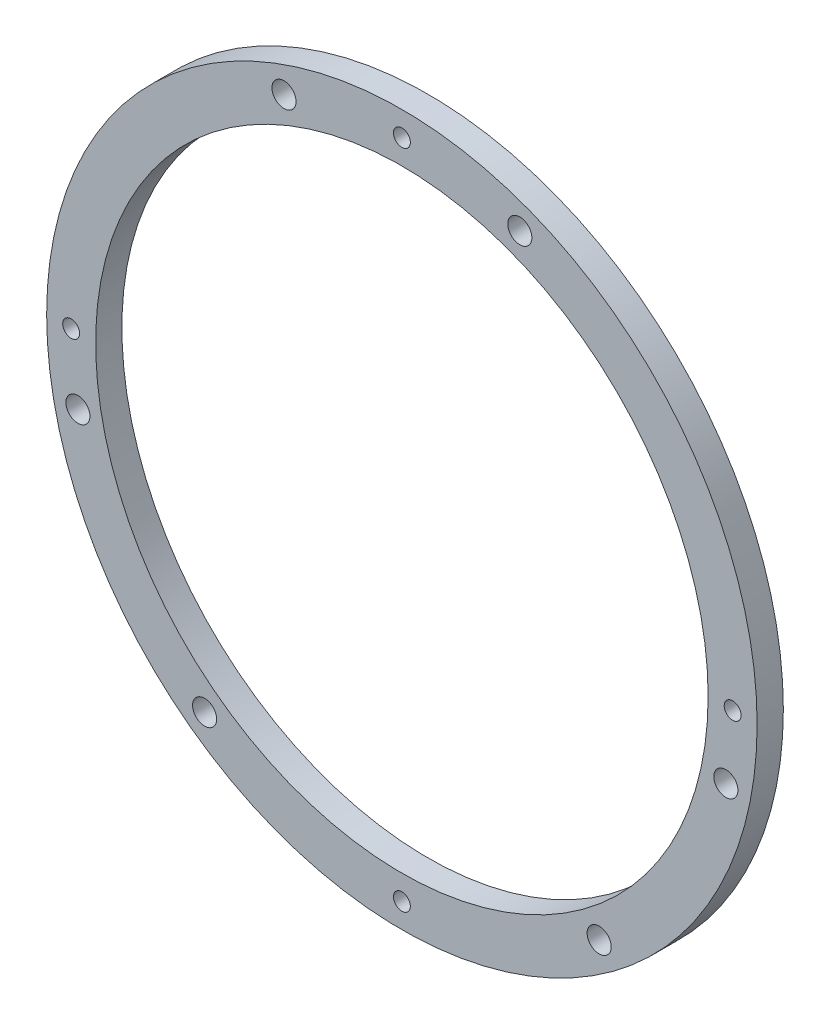
ISO-10303-21;
HEADER;
FILE_DESCRIPTION(('STEP AP214'),'2;1');
FILE_NAME('part.step','',(''),(''),'','','');
FILE_SCHEMA(('AUTOMOTIVE_DESIGN { 1 0 10303 214 1 1 1 1 }'));
ENDSEC;
DATA;
#1=APPLICATION_CONTEXT('core data for automotive mechanical design processes');
#2=APPLICATION_PROTOCOL_DEFINITION('international standard','automotive_design',2000,#1);
#3=PRODUCT_CONTEXT('',#1,'mechanical');
#4=PRODUCT('Part','Part','',(#3));
#5=PRODUCT_RELATED_PRODUCT_CATEGORY('part','',(#4));
#6=PRODUCT_DEFINITION_FORMATION('','',#4);
#7=PRODUCT_DEFINITION_CONTEXT('part definition',#1,'design');
#8=PRODUCT_DEFINITION('design','',#6,#7);
#9=PRODUCT_DEFINITION_SHAPE('','',#8);
#10=(LENGTH_UNIT() NAMED_UNIT(*) SI_UNIT(.MILLI.,.METRE.));
#11=(NAMED_UNIT(*) PLANE_ANGLE_UNIT() SI_UNIT($,.RADIAN.));
#12=(NAMED_UNIT(*) SI_UNIT($,.STERADIAN.) SOLID_ANGLE_UNIT());
#13=UNCERTAINTY_MEASURE_WITH_UNIT(LENGTH_MEASURE(1.E-05),#10,'distance_accuracy_value','');
#14=(GEOMETRIC_REPRESENTATION_CONTEXT(3) GLOBAL_UNCERTAINTY_ASSIGNED_CONTEXT((#13)) GLOBAL_UNIT_ASSIGNED_CONTEXT((#10,
#11,#12)) REPRESENTATION_CONTEXT('',''));
#15=CARTESIAN_POINT('',(0.,0.,0.));
#16=DIRECTION('',(0.,0.,1.));
#17=DIRECTION('',(1.,0.,0.));
#18=AXIS2_PLACEMENT_3D('',#15,#16,#17);
#19=CARTESIAN_POINT('',(0.,0.,-63.7794));
#20=DIRECTION('',(0.,0.,1.));
#21=DIRECTION('',(1.,0.,0.));
#22=AXIS2_PLACEMENT_3D('',#19,#20,#21);
#23=PLANE('',#22);
#24=CARTESIAN_POINT('',(40.9020969085849,-55.0475691423403,-63.7794));
#25=DIRECTION('',(0.,0.,1.));
#26=DIRECTION('',(1.,0.,0.));
#27=AXIS2_PLACEMENT_3D('',#24,#25,#26);
#28=CIRCLE('',#27,2.5);
#29=CARTESIAN_POINT('',(43.4020969085849,-55.0475691423403,-63.7794));
#30=VERTEX_POINT('',#29);
#31=EDGE_CURVE('E239',#30,#30,#28,.T.);
#32=ORIENTED_EDGE('',*,*,#31,.F.);
#33=EDGE_LOOP('',(#32));
#34=FACE_BOUND('',#33,.T.);
#35=CARTESIAN_POINT('',(-67.176013668197,-13.805780950392,-63.7794));
#36=DIRECTION('',(0.,0.,1.));
#37=DIRECTION('',(1.,0.,0.));
#38=AXIS2_PLACEMENT_3D('',#35,#36,#37);
#39=CIRCLE('',#38,2.50000000000001);
#40=CARTESIAN_POINT('',(-64.676013668197,-13.805780950392,-63.7794));
#41=VERTEX_POINT('',#40);
#42=EDGE_CURVE('E119',#41,#41,#39,.T.);
#43=ORIENTED_EDGE('',*,*,#42,.F.);
#44=EDGE_LOOP('',(#43));
#45=FACE_BOUND('',#44,.T.);
#46=CARTESIAN_POINT('',(-24.4499682778964,64.0735159891344,-63.7794));
#47=DIRECTION('',(0.,0.,1.));
#48=DIRECTION('',(1.,0.,0.));
#49=AXIS2_PLACEMENT_3D('',#46,#47,#48);
#50=CIRCLE('',#49,2.5);
#51=CARTESIAN_POINT('',(-21.9499682778964,64.0735159891344,-63.7794));
#52=VERTEX_POINT('',#51);
#53=EDGE_CURVE('E102',#52,#52,#50,.T.);
#54=ORIENTED_EDGE('',*,*,#53,.F.);
#55=EDGE_LOOP('',(#54));
#56=FACE_BOUND('',#55,.T.);
#57=CARTESIAN_POINT('',(68.58,0.,-63.7794));
#58=DIRECTION('',(0.,0.,1.));
#59=DIRECTION('',(1.,0.,0.));
#60=AXIS2_PLACEMENT_3D('',#57,#58,#59);
#61=CIRCLE('',#60,1.75);
#62=CARTESIAN_POINT('',(70.33,0.,-63.7794));
#63=VERTEX_POINT('',#62);
#64=EDGE_CURVE('E103',#63,#63,#61,.T.);
#65=ORIENTED_EDGE('',*,*,#64,.F.);
#66=EDGE_LOOP('',(#65));
#67=FACE_BOUND('',#66,.T.);
#68=CARTESIAN_POINT('',(-68.58,0.,-63.7794));
#69=DIRECTION('',(0.,0.,1.));
#70=DIRECTION('',(1.,0.,0.));
#71=AXIS2_PLACEMENT_3D('',#68,#69,#70);
#72=CIRCLE('',#71,1.75);
#73=CARTESIAN_POINT('',(-66.83,0.,-63.7794));
#74=VERTEX_POINT('',#73);
#75=EDGE_CURVE('E76',#74,#74,#72,.T.);
#76=ORIENTED_EDGE('',*,*,#75,.F.);
#77=EDGE_LOOP('',(#76));
#78=FACE_BOUND('',#77,.T.);
#79=CARTESIAN_POINT('',(0.,0.,-63.7794));
#80=DIRECTION('',(0.,0.,1.));
#81=DIRECTION('',(1.,0.,0.));
#82=AXIS2_PLACEMENT_3D('',#79,#80,#81);
#83=CIRCLE('',#82,73.66);
#84=CARTESIAN_POINT('',(73.66,0.,-63.7794));
#85=VERTEX_POINT('',#84);
#86=EDGE_CURVE('E11',#85,#85,#83,.T.);
#87=ORIENTED_EDGE('',*,*,#86,.T.);
#88=EDGE_LOOP('',(#87));
#89=FACE_BOUND('',#88,.T.);
#90=CARTESIAN_POINT('',(0.,0.,-63.7794));
#91=DIRECTION('',(0.,0.,1.));
#92=DIRECTION('',(1.,0.,0.));
#93=AXIS2_PLACEMENT_3D('',#90,#91,#92);
#94=CIRCLE('',#93,63.5);
#95=CARTESIAN_POINT('',(63.5,0.,-63.7794));
#96=VERTEX_POINT('',#95);
#97=EDGE_CURVE('E57',#96,#96,#94,.T.);
#98=ORIENTED_EDGE('',*,*,#97,.F.);
#99=EDGE_LOOP('',(#98));
#100=FACE_BOUND('',#99,.T.);
#101=CARTESIAN_POINT('',(0.,68.58,-63.7794));
#102=DIRECTION('',(0.,0.,1.));
#103=DIRECTION('',(1.,0.,0.));
#104=AXIS2_PLACEMENT_3D('',#101,#102,#103);
#105=CIRCLE('',#104,1.75);
#106=CARTESIAN_POINT('',(1.75,68.58,-63.7794));
#107=VERTEX_POINT('',#106);
#108=EDGE_CURVE('E77',#107,#107,#105,.T.);
#109=ORIENTED_EDGE('',*,*,#108,.F.);
#110=EDGE_LOOP('',(#109));
#111=FACE_BOUND('',#110,.T.);
#112=CARTESIAN_POINT('',(0.,-68.58,-63.7794));
#113=DIRECTION('',(0.,0.,1.));
#114=DIRECTION('',(1.,0.,0.));
#115=AXIS2_PLACEMENT_3D('',#112,#113,#114);
#116=CIRCLE('',#115,1.75);
#117=CARTESIAN_POINT('',(1.75000000000003,-68.58,-63.7794));
#118=VERTEX_POINT('',#117);
#119=EDGE_CURVE('E88',#118,#118,#116,.T.);
#120=ORIENTED_EDGE('',*,*,#119,.F.);
#121=EDGE_LOOP('',(#120));
#122=FACE_BOUND('',#121,.T.);
#123=CARTESIAN_POINT('',(24.4499682778964,64.0735159891344,-63.7794));
#124=DIRECTION('',(0.,0.,1.));
#125=DIRECTION('',(1.,0.,0.));
#126=AXIS2_PLACEMENT_3D('',#123,#124,#125);
#127=CIRCLE('',#126,2.5);
#128=CARTESIAN_POINT('',(26.9499682778964,64.0735159891344,-63.7794));
#129=VERTEX_POINT('',#128);
#130=EDGE_CURVE('E118',#129,#129,#127,.T.);
#131=ORIENTED_EDGE('',*,*,#130,.F.);
#132=EDGE_LOOP('',(#131));
#133=FACE_BOUND('',#132,.T.);
#134=CARTESIAN_POINT('',(-40.9020969085849,-55.0475691423403,-63.7794));
#135=DIRECTION('',(0.,0.,1.));
#136=DIRECTION('',(1.,0.,0.));
#137=AXIS2_PLACEMENT_3D('',#134,#135,#136);
#138=CIRCLE('',#137,2.5);
#139=CARTESIAN_POINT('',(-38.4020969085849,-55.0475691423403,-63.7794));
#140=VERTEX_POINT('',#139);
#141=EDGE_CURVE('E226',#140,#140,#138,.T.);
#142=ORIENTED_EDGE('',*,*,#141,.F.);
#143=EDGE_LOOP('',(#142));
#144=FACE_BOUND('',#143,.T.);
#145=CARTESIAN_POINT('',(67.176013668197,-13.805780950392,-63.7794));
#146=DIRECTION('',(0.,0.,1.));
#147=DIRECTION('',(1.,0.,0.));
#148=AXIS2_PLACEMENT_3D('',#145,#146,#147);
#149=CIRCLE('',#148,2.50000000000001);
#150=CARTESIAN_POINT('',(69.676013668197,-13.805780950392,-63.7794));
#151=VERTEX_POINT('',#150);
#152=EDGE_CURVE('E245',#151,#151,#149,.T.);
#153=ORIENTED_EDGE('',*,*,#152,.F.);
#154=EDGE_LOOP('',(#153));
#155=FACE_BOUND('',#154,.T.);
#156=ADVANCED_FACE('F40',(#34,#45,#56,#67,#78,#89,#100,#111,#122,#133,#144,#155),#23,.T.);
#157=CARTESIAN_POINT('',(0.,0.,-69.215));
#158=DIRECTION('',(0.,0.,1.));
#159=DIRECTION('',(1.,0.,0.));
#160=AXIS2_PLACEMENT_3D('',#157,#158,#159);
#161=PLANE('',#160);
#162=CARTESIAN_POINT('',(0.,0.,-69.215));
#163=DIRECTION('',(0.,0.,1.));
#164=DIRECTION('',(1.,0.,0.));
#165=AXIS2_PLACEMENT_3D('',#162,#163,#164);
#166=CIRCLE('',#165,73.66);
#167=CARTESIAN_POINT('',(73.66,0.,-69.215));
#168=VERTEX_POINT('',#167);
#169=EDGE_CURVE('E45',#168,#168,#166,.T.);
#170=ORIENTED_EDGE('',*,*,#169,.F.);
#171=EDGE_LOOP('',(#170));
#172=FACE_BOUND('',#171,.T.);
#173=CARTESIAN_POINT('',(0.,0.,-69.215));
#174=DIRECTION('',(0.,0.,1.));
#175=DIRECTION('',(1.,0.,0.));
#176=AXIS2_PLACEMENT_3D('',#173,#174,#175);
#177=CIRCLE('',#176,63.5);
#178=CARTESIAN_POINT('',(63.5,0.,-69.215));
#179=VERTEX_POINT('',#178);
#180=EDGE_CURVE('E60',#179,#179,#177,.T.);
#181=ORIENTED_EDGE('',*,*,#180,.T.);
#182=EDGE_LOOP('',(#181));
#183=FACE_BOUND('',#182,.T.);
#184=CARTESIAN_POINT('',(-68.58,0.,-69.215));
#185=DIRECTION('',(0.,0.,1.));
#186=DIRECTION('',(1.,0.,0.));
#187=AXIS2_PLACEMENT_3D('',#184,#185,#186);
#188=CIRCLE('',#187,1.75);
#189=CARTESIAN_POINT('',(-66.83,0.,-69.215));
#190=VERTEX_POINT('',#189);
#191=EDGE_CURVE('E71',#190,#190,#188,.T.);
#192=ORIENTED_EDGE('',*,*,#191,.T.);
#193=EDGE_LOOP('',(#192));
#194=FACE_BOUND('',#193,.T.);
#195=CARTESIAN_POINT('',(0.,68.58,-69.215));
#196=DIRECTION('',(0.,0.,1.));
#197=DIRECTION('',(1.,0.,0.));
#198=AXIS2_PLACEMENT_3D('',#195,#196,#197);
#199=CIRCLE('',#198,1.75);
#200=CARTESIAN_POINT('',(1.75,68.58,-69.215));
#201=VERTEX_POINT('',#200);
#202=EDGE_CURVE('E137',#201,#201,#199,.T.);
#203=ORIENTED_EDGE('',*,*,#202,.T.);
#204=EDGE_LOOP('',(#203));
#205=FACE_BOUND('',#204,.T.);
#206=CARTESIAN_POINT('',(68.58,0.,-69.215));
#207=DIRECTION('',(0.,0.,1.));
#208=DIRECTION('',(1.,0.,0.));
#209=AXIS2_PLACEMENT_3D('',#206,#207,#208);
#210=CIRCLE('',#209,1.75);
#211=CARTESIAN_POINT('',(70.33,0.,-69.215));
#212=VERTEX_POINT('',#211);
#213=EDGE_CURVE('E94',#212,#212,#210,.T.);
#214=ORIENTED_EDGE('',*,*,#213,.T.);
#215=EDGE_LOOP('',(#214));
#216=FACE_BOUND('',#215,.T.);
#217=CARTESIAN_POINT('',(0.,-68.58,-69.215));
#218=DIRECTION('',(0.,0.,1.));
#219=DIRECTION('',(1.,0.,0.));
#220=AXIS2_PLACEMENT_3D('',#217,#218,#219);
#221=CIRCLE('',#220,1.75);
#222=CARTESIAN_POINT('',(1.75000000000003,-68.58,-69.215));
#223=VERTEX_POINT('',#222);
#224=EDGE_CURVE('E95',#223,#223,#221,.T.);
#225=ORIENTED_EDGE('',*,*,#224,.T.);
#226=EDGE_LOOP('',(#225));
#227=FACE_BOUND('',#226,.T.);
#228=CARTESIAN_POINT('',(-24.4499682778964,64.0735159891344,-69.215));
#229=DIRECTION('',(0.,0.,1.));
#230=DIRECTION('',(1.,0.,0.));
#231=AXIS2_PLACEMENT_3D('',#228,#229,#230);
#232=CIRCLE('',#231,2.5);
#233=CARTESIAN_POINT('',(-21.9499682778964,64.0735159891344,-69.215));
#234=VERTEX_POINT('',#233);
#235=EDGE_CURVE('E96',#234,#234,#232,.T.);
#236=ORIENTED_EDGE('',*,*,#235,.T.);
#237=EDGE_LOOP('',(#236));
#238=FACE_BOUND('',#237,.T.);
#239=CARTESIAN_POINT('',(24.4499682778964,64.0735159891344,-69.215));
#240=DIRECTION('',(0.,0.,1.));
#241=DIRECTION('',(1.,0.,0.));
#242=AXIS2_PLACEMENT_3D('',#239,#240,#241);
#243=CIRCLE('',#242,2.5);
#244=CARTESIAN_POINT('',(26.9499682778964,64.0735159891344,-69.215));
#245=VERTEX_POINT('',#244);
#246=EDGE_CURVE('E113',#245,#245,#243,.T.);
#247=ORIENTED_EDGE('',*,*,#246,.T.);
#248=EDGE_LOOP('',(#247));
#249=FACE_BOUND('',#248,.T.);
#250=CARTESIAN_POINT('',(-67.176013668197,-13.805780950392,-69.215));
#251=DIRECTION('',(0.,0.,1.));
#252=DIRECTION('',(1.,0.,0.));
#253=AXIS2_PLACEMENT_3D('',#250,#251,#252);
#254=CIRCLE('',#253,2.50000000000001);
#255=CARTESIAN_POINT('',(-64.676013668197,-13.805780950392,-69.215));
#256=VERTEX_POINT('',#255);
#257=EDGE_CURVE('E223',#256,#256,#254,.T.);
#258=ORIENTED_EDGE('',*,*,#257,.T.);
#259=EDGE_LOOP('',(#258));
#260=FACE_BOUND('',#259,.T.);
#261=CARTESIAN_POINT('',(-40.9020969085849,-55.0475691423403,-69.215));
#262=DIRECTION('',(0.,0.,1.));
#263=DIRECTION('',(1.,0.,0.));
#264=AXIS2_PLACEMENT_3D('',#261,#262,#263);
#265=CIRCLE('',#264,2.5);
#266=CARTESIAN_POINT('',(-38.4020969085849,-55.0475691423403,-69.215));
#267=VERTEX_POINT('',#266);
#268=EDGE_CURVE('E232',#267,#267,#265,.T.);
#269=ORIENTED_EDGE('',*,*,#268,.T.);
#270=EDGE_LOOP('',(#269));
#271=FACE_BOUND('',#270,.T.);
#272=CARTESIAN_POINT('',(40.9020969085849,-55.0475691423403,-69.215));
#273=DIRECTION('',(0.,0.,1.));
#274=DIRECTION('',(1.,0.,0.));
#275=AXIS2_PLACEMENT_3D('',#272,#273,#274);
#276=CIRCLE('',#275,2.5);
#277=CARTESIAN_POINT('',(43.4020969085849,-55.0475691423403,-69.215));
#278=VERTEX_POINT('',#277);
#279=EDGE_CURVE('E242',#278,#278,#276,.T.);
#280=ORIENTED_EDGE('',*,*,#279,.T.);
#281=EDGE_LOOP('',(#280));
#282=FACE_BOUND('',#281,.T.);
#283=CARTESIAN_POINT('',(67.176013668197,-13.805780950392,-69.215));
#284=DIRECTION('',(0.,0.,1.));
#285=DIRECTION('',(1.,0.,0.));
#286=AXIS2_PLACEMENT_3D('',#283,#284,#285);
#287=CIRCLE('',#286,2.50000000000001);
#288=CARTESIAN_POINT('',(69.676013668197,-13.805780950392,-69.215));
#289=VERTEX_POINT('',#288);
#290=EDGE_CURVE('E249',#289,#289,#287,.T.);
#291=ORIENTED_EDGE('',*,*,#290,.T.);
#292=EDGE_LOOP('',(#291));
#293=FACE_BOUND('',#292,.T.);
#294=ADVANCED_FACE('F154',(#172,#183,#194,#205,#216,#227,#238,#249,#260,#271,#282,#293),#161,.F.);
#295=CARTESIAN_POINT('',(0.,0.,-63.7794));
#296=DIRECTION('',(0.,0.,-1.));
#297=DIRECTION('',(-1.,0.,0.));
#298=AXIS2_PLACEMENT_3D('',#295,#296,#297);
#299=CYLINDRICAL_SURFACE('',#298,73.66);
#300=ORIENTED_EDGE('',*,*,#86,.F.);
#301=EDGE_LOOP('',(#300));
#302=FACE_BOUND('',#301,.T.);
#303=ORIENTED_EDGE('',*,*,#169,.T.);
#304=EDGE_LOOP('',(#303));
#305=FACE_BOUND('',#304,.T.);
#306=ADVANCED_FACE('F43',(#302,#305),#299,.T.);
#307=CARTESIAN_POINT('',(0.,0.,-63.7794));
#308=DIRECTION('',(0.,0.,-1.));
#309=DIRECTION('',(-1.,0.,0.));
#310=AXIS2_PLACEMENT_3D('',#307,#308,#309);
#311=CYLINDRICAL_SURFACE('',#310,63.5);
#312=ORIENTED_EDGE('',*,*,#97,.T.);
#313=EDGE_LOOP('',(#312));
#314=FACE_BOUND('',#313,.T.);
#315=ORIENTED_EDGE('',*,*,#180,.F.);
#316=EDGE_LOOP('',(#315));
#317=FACE_BOUND('',#316,.T.);
#318=ADVANCED_FACE('F187',(#314,#317),#311,.F.);
#319=CARTESIAN_POINT('',(-68.58,0.,-63.7794));
#320=DIRECTION('',(0.,0.,-1.));
#321=DIRECTION('',(-1.,0.,0.));
#322=AXIS2_PLACEMENT_3D('',#319,#320,#321);
#323=CYLINDRICAL_SURFACE('',#322,1.75);
#324=ORIENTED_EDGE('',*,*,#75,.T.);
#325=EDGE_LOOP('',(#324));
#326=FACE_BOUND('',#325,.T.);
#327=ORIENTED_EDGE('',*,*,#191,.F.);
#328=EDGE_LOOP('',(#327));
#329=FACE_BOUND('',#328,.T.);
#330=ADVANCED_FACE('F169',(#326,#329),#323,.F.);
#331=CARTESIAN_POINT('',(0.,68.58,-63.7794));
#332=DIRECTION('',(0.,0.,-1.));
#333=DIRECTION('',(-1.,0.,0.));
#334=AXIS2_PLACEMENT_3D('',#331,#332,#333);
#335=CYLINDRICAL_SURFACE('',#334,1.75);
#336=ORIENTED_EDGE('',*,*,#108,.T.);
#337=EDGE_LOOP('',(#336));
#338=FACE_BOUND('',#337,.T.);
#339=ORIENTED_EDGE('',*,*,#202,.F.);
#340=EDGE_LOOP('',(#339));
#341=FACE_BOUND('',#340,.T.);
#342=ADVANCED_FACE('F160',(#338,#341),#335,.F.);
#343=CARTESIAN_POINT('',(68.58,0.,-63.7794));
#344=DIRECTION('',(0.,0.,-1.));
#345=DIRECTION('',(-1.,0.,0.));
#346=AXIS2_PLACEMENT_3D('',#343,#344,#345);
#347=CYLINDRICAL_SURFACE('',#346,1.75);
#348=ORIENTED_EDGE('',*,*,#64,.T.);
#349=EDGE_LOOP('',(#348));
#350=FACE_BOUND('',#349,.T.);
#351=ORIENTED_EDGE('',*,*,#213,.F.);
#352=EDGE_LOOP('',(#351));
#353=FACE_BOUND('',#352,.T.);
#354=ADVANCED_FACE('F157',(#350,#353),#347,.F.);
#355=CARTESIAN_POINT('',(0.,-68.58,-63.7794));
#356=DIRECTION('',(0.,0.,-1.));
#357=DIRECTION('',(-1.,0.,0.));
#358=AXIS2_PLACEMENT_3D('',#355,#356,#357);
#359=CYLINDRICAL_SURFACE('',#358,1.75);
#360=ORIENTED_EDGE('',*,*,#119,.T.);
#361=EDGE_LOOP('',(#360));
#362=FACE_BOUND('',#361,.T.);
#363=ORIENTED_EDGE('',*,*,#224,.F.);
#364=EDGE_LOOP('',(#363));
#365=FACE_BOUND('',#364,.T.);
#366=ADVANCED_FACE('F159',(#362,#365),#359,.F.);
#367=CARTESIAN_POINT('',(-24.4499682778964,64.0735159891344,-63.7794));
#368=DIRECTION('',(0.,0.,-1.));
#369=DIRECTION('',(-1.,0.,0.));
#370=AXIS2_PLACEMENT_3D('',#367,#368,#369);
#371=CYLINDRICAL_SURFACE('',#370,2.5);
#372=ORIENTED_EDGE('',*,*,#53,.T.);
#373=EDGE_LOOP('',(#372));
#374=FACE_BOUND('',#373,.T.);
#375=ORIENTED_EDGE('',*,*,#235,.F.);
#376=EDGE_LOOP('',(#375));
#377=FACE_BOUND('',#376,.T.);
#378=ADVANCED_FACE('F166',(#374,#377),#371,.F.);
#379=CARTESIAN_POINT('',(24.4499682778964,64.0735159891344,-63.7794));
#380=DIRECTION('',(0.,0.,-1.));
#381=DIRECTION('',(-1.,0.,0.));
#382=AXIS2_PLACEMENT_3D('',#379,#380,#381);
#383=CYLINDRICAL_SURFACE('',#382,2.5);
#384=ORIENTED_EDGE('',*,*,#130,.T.);
#385=EDGE_LOOP('',(#384));
#386=FACE_BOUND('',#385,.T.);
#387=ORIENTED_EDGE('',*,*,#246,.F.);
#388=EDGE_LOOP('',(#387));
#389=FACE_BOUND('',#388,.T.);
#390=ADVANCED_FACE('F195',(#386,#389),#383,.F.);
#391=CARTESIAN_POINT('',(-67.176013668197,-13.805780950392,-63.7794));
#392=DIRECTION('',(0.,0.,-1.));
#393=DIRECTION('',(-1.,0.,0.));
#394=AXIS2_PLACEMENT_3D('',#391,#392,#393);
#395=CYLINDRICAL_SURFACE('',#394,2.50000000000001);
#396=ORIENTED_EDGE('',*,*,#42,.T.);
#397=EDGE_LOOP('',(#396));
#398=FACE_BOUND('',#397,.T.);
#399=ORIENTED_EDGE('',*,*,#257,.F.);
#400=EDGE_LOOP('',(#399));
#401=FACE_BOUND('',#400,.T.);
#402=ADVANCED_FACE('F210',(#398,#401),#395,.F.);
#403=CARTESIAN_POINT('',(-40.9020969085849,-55.0475691423403,-63.7794));
#404=DIRECTION('',(0.,0.,-1.));
#405=DIRECTION('',(-1.,0.,0.));
#406=AXIS2_PLACEMENT_3D('',#403,#404,#405);
#407=CYLINDRICAL_SURFACE('',#406,2.5);
#408=ORIENTED_EDGE('',*,*,#141,.T.);
#409=EDGE_LOOP('',(#408));
#410=FACE_BOUND('',#409,.T.);
#411=ORIENTED_EDGE('',*,*,#268,.F.);
#412=EDGE_LOOP('',(#411));
#413=FACE_BOUND('',#412,.T.);
#414=ADVANCED_FACE('F204',(#410,#413),#407,.F.);
#415=CARTESIAN_POINT('',(40.9020969085849,-55.0475691423403,-63.7794));
#416=DIRECTION('',(0.,0.,-1.));
#417=DIRECTION('',(-1.,0.,0.));
#418=AXIS2_PLACEMENT_3D('',#415,#416,#417);
#419=CYLINDRICAL_SURFACE('',#418,2.5);
#420=ORIENTED_EDGE('',*,*,#31,.T.);
#421=EDGE_LOOP('',(#420));
#422=FACE_BOUND('',#421,.T.);
#423=ORIENTED_EDGE('',*,*,#279,.F.);
#424=EDGE_LOOP('',(#423));
#425=FACE_BOUND('',#424,.T.);
#426=ADVANCED_FACE('F199',(#422,#425),#419,.F.);
#427=CARTESIAN_POINT('',(67.176013668197,-13.805780950392,-63.7794));
#428=DIRECTION('',(0.,0.,-1.));
#429=DIRECTION('',(-1.,0.,0.));
#430=AXIS2_PLACEMENT_3D('',#427,#428,#429);
#431=CYLINDRICAL_SURFACE('',#430,2.50000000000001);
#432=ORIENTED_EDGE('',*,*,#152,.T.);
#433=EDGE_LOOP('',(#432));
#434=FACE_BOUND('',#433,.T.);
#435=ORIENTED_EDGE('',*,*,#290,.F.);
#436=EDGE_LOOP('',(#435));
#437=FACE_BOUND('',#436,.T.);
#438=ADVANCED_FACE('F203',(#434,#437),#431,.F.);
#439=CLOSED_SHELL('',(#156,#294,#306,#318,#330,#342,#354,#366,#378,#390,#402,#414,#426,#438));
#440=MANIFOLD_SOLID_BREP('B2',#439);
#441=ADVANCED_BREP_SHAPE_REPRESENTATION('',(#18,#440),#14);
#442=SHAPE_DEFINITION_REPRESENTATION(#9,#441);
ENDSEC;
END-ISO-10303-21;
